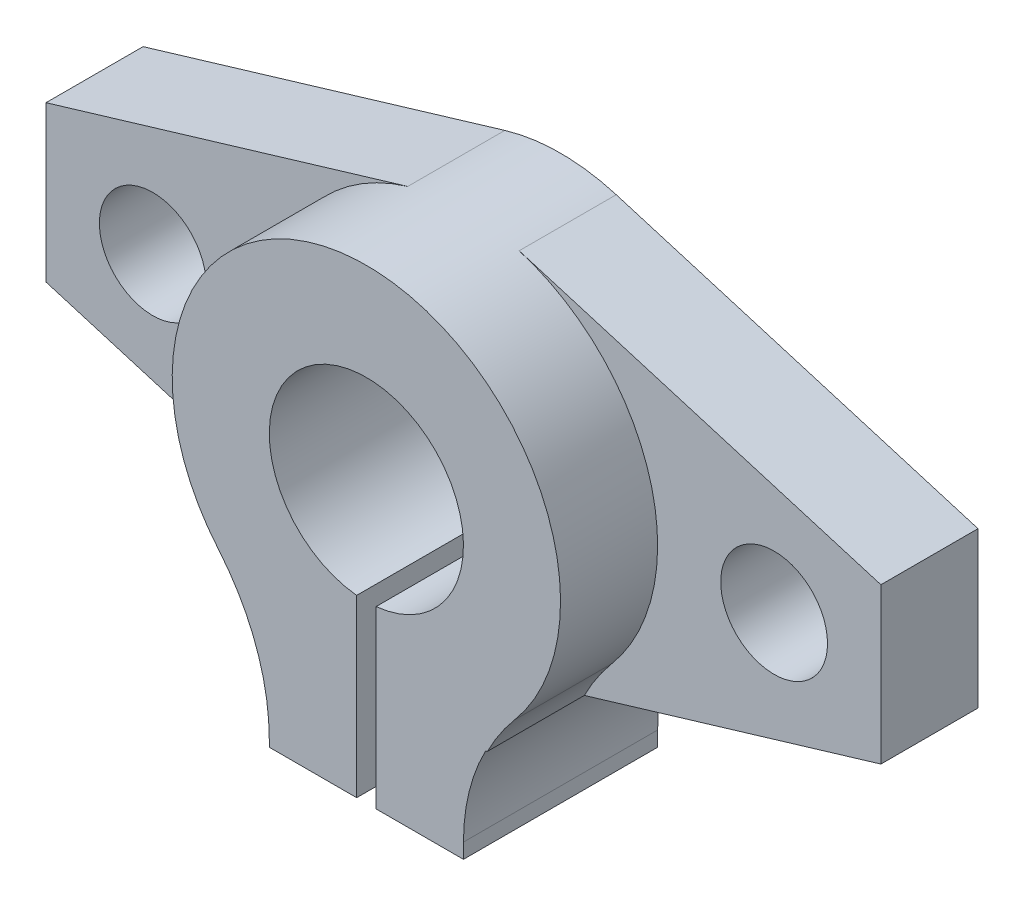
ISO-10303-21;
HEADER;
FILE_DESCRIPTION(('STEP AP214'),'2;1');
FILE_NAME('part.step','',(''),(''),'','','');
FILE_SCHEMA(('AUTOMOTIVE_DESIGN { 1 0 10303 214 1 1 1 1 }'));
ENDSEC;
DATA;
#1=APPLICATION_CONTEXT('core data for automotive mechanical design processes');
#2=APPLICATION_PROTOCOL_DEFINITION('international standard','automotive_design',2000,#1);
#3=PRODUCT_CONTEXT('',#1,'mechanical');
#4=PRODUCT('Part','Part','',(#3));
#5=PRODUCT_RELATED_PRODUCT_CATEGORY('part','',(#4));
#6=PRODUCT_DEFINITION_FORMATION('','',#4);
#7=PRODUCT_DEFINITION_CONTEXT('part definition',#1,'design');
#8=PRODUCT_DEFINITION('design','',#6,#7);
#9=PRODUCT_DEFINITION_SHAPE('','',#8);
#10=(LENGTH_UNIT() NAMED_UNIT(*) SI_UNIT(.MILLI.,.METRE.));
#11=(NAMED_UNIT(*) PLANE_ANGLE_UNIT() SI_UNIT($,.RADIAN.));
#12=(NAMED_UNIT(*) SI_UNIT($,.STERADIAN.) SOLID_ANGLE_UNIT());
#13=UNCERTAINTY_MEASURE_WITH_UNIT(LENGTH_MEASURE(1.E-05),#10,'distance_accuracy_value','');
#14=(GEOMETRIC_REPRESENTATION_CONTEXT(3) GLOBAL_UNCERTAINTY_ASSIGNED_CONTEXT((#13)) GLOBAL_UNIT_ASSIGNED_CONTEXT((#10,
#11,#12)) REPRESENTATION_CONTEXT('',''));
#15=CARTESIAN_POINT('',(0.,0.,0.));
#16=DIRECTION('',(0.,0.,1.));
#17=DIRECTION('',(1.,0.,0.));
#18=AXIS2_PLACEMENT_3D('',#15,#16,#17);
#19=CARTESIAN_POINT('',(0.,0.,0.));
#20=DIRECTION('',(0.,0.,1.));
#21=DIRECTION('',(1.,0.,0.));
#22=AXIS2_PLACEMENT_3D('',#19,#20,#21);
#23=PLANE('',#22);
#24=CARTESIAN_POINT('',(16.,0.,0.));
#25=DIRECTION('',(0.,0.,1.));
#26=DIRECTION('',(1.,0.,0.));
#27=AXIS2_PLACEMENT_3D('',#24,#25,#26);
#28=CIRCLE('',#27,2.75);
#29=CARTESIAN_POINT('',(18.75,0.,0.));
#30=VERTEX_POINT('',#29);
#31=EDGE_CURVE('E216',#30,#30,#28,.F.);
#32=ORIENTED_EDGE('',*,*,#31,.F.);
#33=EDGE_LOOP('',(#32));
#34=FACE_BOUND('',#33,.T.);
#35=CARTESIAN_POINT('',(-16.,0.,0.));
#36=DIRECTION('',(0.,0.,1.));
#37=DIRECTION('',(1.,0.,0.));
#38=AXIS2_PLACEMENT_3D('',#35,#36,#37);
#39=CIRCLE('',#38,2.75);
#40=CARTESIAN_POINT('',(-13.25,0.,0.));
#41=VERTEX_POINT('',#40);
#42=EDGE_CURVE('E282',#41,#41,#39,.T.);
#43=ORIENTED_EDGE('',*,*,#42,.T.);
#44=EDGE_LOOP('',(#43));
#45=FACE_BOUND('',#44,.T.);
#46=CARTESIAN_POINT('',(0.,0.,0.));
#47=DIRECTION('',(0.,0.,1.));
#48=DIRECTION('',(1.,0.,0.));
#49=AXIS2_PLACEMENT_3D('',#46,#47,#48);
#50=CIRCLE('',#49,5.);
#51=CARTESIAN_POINT('',(-0.5,-4.9749371855331,0.));
#52=VERTEX_POINT('',#51);
#53=CARTESIAN_POINT('',(0.500000000000003,-4.9749371855331,0.));
#54=VERTEX_POINT('',#53);
#55=EDGE_CURVE('E341',#52,#54,#50,.F.);
#56=ORIENTED_EDGE('',*,*,#55,.F.);
#57=DIRECTION('',(0.,1.,0.));
#58=VECTOR('',#57,1.);
#59=CARTESIAN_POINT('',(-0.5,-14.,0.));
#60=LINE('',#59,#58);
#61=CARTESIAN_POINT('',(-0.5,-14.,0.));
#62=VERTEX_POINT('',#61);
#63=EDGE_CURVE('E228',#62,#52,#60,.T.);
#64=ORIENTED_EDGE('',*,*,#63,.F.);
#65=DIRECTION('',(-1.,0.,0.));
#66=VECTOR('',#65,1.);
#67=CARTESIAN_POINT('',(-0.5,-14.,0.));
#68=LINE('',#67,#66);
#69=CARTESIAN_POINT('',(-5.,-14.,0.));
#70=VERTEX_POINT('',#69);
#71=EDGE_CURVE('E286',#62,#70,#68,.T.);
#72=ORIENTED_EDGE('',*,*,#71,.T.);
#73=DIRECTION('',(0.,1.,0.));
#74=VECTOR('',#73,1.);
#75=CARTESIAN_POINT('',(-5.,-14.,0.));
#76=LINE('',#75,#74);
#77=CARTESIAN_POINT('',(-5.,-13.659774106197,0.));
#78=VERTEX_POINT('',#77);
#79=EDGE_CURVE('E289',#70,#78,#76,.T.);
#80=ORIENTED_EDGE('',*,*,#79,.T.);
#81=CARTESIAN_POINT('',(-16.1589428632331,-13.659774106197,0.));
#82=DIRECTION('',(0.,0.,-1.));
#83=DIRECTION('',(-1.,0.,0.));
#84=AXIS2_PLACEMENT_3D('',#81,#82,#83);
#85=CIRCLE('',#84,11.1589428632331);
#86=CARTESIAN_POINT('',(-6.22623076309113,-8.57418307264013,0.));
#87=VERTEX_POINT('',#86);
#88=EDGE_CURVE('E292',#87,#78,#85,.T.);
#89=ORIENTED_EDGE('',*,*,#88,.F.);
#90=DIRECTION('',(0.957963371215263,-0.286890535587858,0.));
#91=VECTOR('',#90,1.);
#92=CARTESIAN_POINT('',(-2.86890535587858,-9.57963371215263,0.));
#93=LINE('',#92,#91);
#94=CARTESIAN_POINT('',(-21.5,-4.,0.));
#95=VERTEX_POINT('',#94);
#96=EDGE_CURVE('E393',#95,#87,#93,.T.);
#97=ORIENTED_EDGE('',*,*,#96,.F.);
#98=DIRECTION('',(0.,1.,0.));
#99=VECTOR('',#98,1.);
#100=CARTESIAN_POINT('',(-21.5,0.,0.));
#101=LINE('',#100,#99);
#102=CARTESIAN_POINT('',(-21.5,4.,0.));
#103=VERTEX_POINT('',#102);
#104=EDGE_CURVE('E390',#95,#103,#101,.T.);
#105=ORIENTED_EDGE('',*,*,#104,.T.);
#106=DIRECTION('',(0.957963371215263,0.286890535587858,0.));
#107=VECTOR('',#106,1.);
#108=CARTESIAN_POINT('',(-2.86890535587858,9.57963371215263,0.));
#109=LINE('',#108,#107);
#110=CARTESIAN_POINT('',(-2.86890535587858,9.57963371215263,0.));
#111=VERTEX_POINT('',#110);
#112=EDGE_CURVE('E387',#103,#111,#109,.T.);
#113=ORIENTED_EDGE('',*,*,#112,.T.);
#114=CARTESIAN_POINT('',(0.,0.,0.));
#115=DIRECTION('',(0.,0.,1.));
#116=DIRECTION('',(1.,0.,0.));
#117=AXIS2_PLACEMENT_3D('',#114,#115,#116);
#118=CIRCLE('',#117,10.);
#119=CARTESIAN_POINT('',(2.86890535587858,9.57963371215263,0.));
#120=VERTEX_POINT('',#119);
#121=EDGE_CURVE('E294',#120,#111,#118,.T.);
#122=ORIENTED_EDGE('',*,*,#121,.F.);
#123=DIRECTION('',(-0.957963371215263,0.286890535587858,0.));
#124=VECTOR('',#123,1.);
#125=CARTESIAN_POINT('',(2.86890535587858,9.57963371215263,0.));
#126=LINE('',#125,#124);
#127=CARTESIAN_POINT('',(21.5,4.,0.));
#128=VERTEX_POINT('',#127);
#129=EDGE_CURVE('E272',#128,#120,#126,.T.);
#130=ORIENTED_EDGE('',*,*,#129,.F.);
#131=DIRECTION('',(0.,1.,0.));
#132=VECTOR('',#131,1.);
#133=CARTESIAN_POINT('',(21.5,0.,0.));
#134=LINE('',#133,#132);
#135=CARTESIAN_POINT('',(21.5,-4.,0.));
#136=VERTEX_POINT('',#135);
#137=EDGE_CURVE('E269',#136,#128,#134,.T.);
#138=ORIENTED_EDGE('',*,*,#137,.F.);
#139=DIRECTION('',(-0.957963371215263,-0.286890535587858,0.));
#140=VECTOR('',#139,1.);
#141=CARTESIAN_POINT('',(2.86890535587858,-9.57963371215263,0.));
#142=LINE('',#141,#140);
#143=CARTESIAN_POINT('',(6.13497884361172,-8.60151116559181,0.));
#144=VERTEX_POINT('',#143);
#145=EDGE_CURVE('E266',#136,#144,#142,.T.);
#146=ORIENTED_EDGE('',*,*,#145,.T.);
#147=CARTESIAN_POINT('',(15.,-13.228756555323,0.));
#148=DIRECTION('',(0.,0.,1.));
#149=DIRECTION('',(1.,0.,0.));
#150=AXIS2_PLACEMENT_3D('',#147,#148,#149);
#151=CIRCLE('',#150,10.);
#152=CARTESIAN_POINT('',(5.,-13.2287565553229,0.));
#153=VERTEX_POINT('',#152);
#154=EDGE_CURVE('E237',#144,#153,#151,.T.);
#155=ORIENTED_EDGE('',*,*,#154,.T.);
#156=DIRECTION('',(0.,1.,0.));
#157=VECTOR('',#156,1.);
#158=CARTESIAN_POINT('',(5.,-14.,0.));
#159=LINE('',#158,#157);
#160=CARTESIAN_POINT('',(5.,-14.,0.));
#161=VERTEX_POINT('',#160);
#162=EDGE_CURVE('E232',#161,#153,#159,.T.);
#163=ORIENTED_EDGE('',*,*,#162,.F.);
#164=DIRECTION('',(-1.,0.,0.));
#165=VECTOR('',#164,1.);
#166=CARTESIAN_POINT('',(5.,-14.,0.));
#167=LINE('',#166,#165);
#168=CARTESIAN_POINT('',(0.500000000000006,-14.,0.));
#169=VERTEX_POINT('',#168);
#170=EDGE_CURVE('E209',#161,#169,#167,.T.);
#171=ORIENTED_EDGE('',*,*,#170,.T.);
#172=DIRECTION('',(0.,1.,0.));
#173=VECTOR('',#172,1.);
#174=CARTESIAN_POINT('',(0.500000000000006,-14.,0.));
#175=LINE('',#174,#173);
#176=EDGE_CURVE('E221',#169,#54,#175,.T.);
#177=ORIENTED_EDGE('',*,*,#176,.T.);
#178=EDGE_LOOP('',(#56,#64,#72,#80,#89,#97,#105,#113,#122,#130,#138,#146,#155,#163,#171,#177));
#179=FACE_BOUND('',#178,.T.);
#180=ADVANCED_FACE('F124',(#34,#45,#179),#23,.F.);
#181=CARTESIAN_POINT('',(0.,0.,10.));
#182=DIRECTION('',(0.,0.,1.));
#183=DIRECTION('',(1.,0.,0.));
#184=AXIS2_PLACEMENT_3D('',#181,#182,#183);
#185=PLANE('',#184);
#186=DIRECTION('',(0.,1.,0.));
#187=VECTOR('',#186,1.);
#188=CARTESIAN_POINT('',(-0.5,0.,10.));
#189=LINE('',#188,#187);
#190=CARTESIAN_POINT('',(-0.5,-14.,10.));
#191=VERTEX_POINT('',#190);
#192=CARTESIAN_POINT('',(-0.5,-4.9749371855331,9.99999999999999));
#193=VERTEX_POINT('',#192);
#194=EDGE_CURVE('E320',#191,#193,#189,.T.);
#195=ORIENTED_EDGE('',*,*,#194,.T.);
#196=CARTESIAN_POINT('',(0.,0.,9.99999999999999));
#197=DIRECTION('',(0.,0.,1.));
#198=DIRECTION('',(1.,0.,0.));
#199=AXIS2_PLACEMENT_3D('',#196,#197,#198);
#200=CIRCLE('',#199,5.);
#201=CARTESIAN_POINT('',(0.500000000000003,-4.9749371855331,9.99999999999999));
#202=VERTEX_POINT('',#201);
#203=EDGE_CURVE('E12',#193,#202,#200,.F.);
#204=ORIENTED_EDGE('',*,*,#203,.T.);
#205=DIRECTION('',(0.,-1.,0.));
#206=VECTOR('',#205,1.);
#207=CARTESIAN_POINT('',(0.500000000000002,0.,10.));
#208=LINE('',#207,#206);
#209=CARTESIAN_POINT('',(0.500000000000006,-14.,10.));
#210=VERTEX_POINT('',#209);
#211=EDGE_CURVE('E317',#202,#210,#208,.T.);
#212=ORIENTED_EDGE('',*,*,#211,.T.);
#213=DIRECTION('',(1.,0.,0.));
#214=VECTOR('',#213,1.);
#215=CARTESIAN_POINT('',(0.,-14.,10.));
#216=LINE('',#215,#214);
#217=CARTESIAN_POINT('',(5.,-14.,10.));
#218=VERTEX_POINT('',#217);
#219=EDGE_CURVE('E212',#210,#218,#216,.T.);
#220=ORIENTED_EDGE('',*,*,#219,.T.);
#221=DIRECTION('',(0.,1.,0.));
#222=VECTOR('',#221,1.);
#223=CARTESIAN_POINT('',(5.,0.,10.));
#224=LINE('',#223,#222);
#225=CARTESIAN_POINT('',(5.,-13.228756555323,10.));
#226=VERTEX_POINT('',#225);
#227=EDGE_CURVE('E312',#218,#226,#224,.T.);
#228=ORIENTED_EDGE('',*,*,#227,.T.);
#229=CARTESIAN_POINT('',(15.,-13.228756555323,10.));
#230=DIRECTION('',(0.,0.,1.));
#231=DIRECTION('',(1.,0.,0.));
#232=AXIS2_PLACEMENT_3D('',#229,#230,#231);
#233=CIRCLE('',#232,10.);
#234=CARTESIAN_POINT('',(6.13497884361172,-8.60151116559181,10.));
#235=VERTEX_POINT('',#234);
#236=EDGE_CURVE('E306',#226,#235,#233,.F.);
#237=ORIENTED_EDGE('',*,*,#236,.T.);
#238=DIRECTION('',(0.957963371215263,0.286890535587858,0.));
#239=VECTOR('',#238,1.);
#240=CARTESIAN_POINT('',(2.86890535587858,-9.57963371215263,10.));
#241=LINE('',#240,#239);
#242=CARTESIAN_POINT('',(6.22623076309114,-8.57418307264013,10.));
#243=VERTEX_POINT('',#242);
#244=EDGE_CURVE('E325',#235,#243,#241,.T.);
#245=ORIENTED_EDGE('',*,*,#244,.T.);
#246=CARTESIAN_POINT('',(16.1589428632331,-13.659774106197,10.));
#247=DIRECTION('',(0.,0.,1.));
#248=DIRECTION('',(1.,0.,0.));
#249=AXIS2_PLACEMENT_3D('',#246,#247,#248);
#250=CIRCLE('',#249,11.1589428632331);
#251=CARTESIAN_POINT('',(7.63693298274921,-6.45579233069011,10.));
#252=VERTEX_POINT('',#251);
#253=EDGE_CURVE('E328',#252,#243,#250,.T.);
#254=ORIENTED_EDGE('',*,*,#253,.F.);
#255=CARTESIAN_POINT('',(0.,0.,10.));
#256=DIRECTION('',(0.,0.,1.));
#257=DIRECTION('',(1.,0.,0.));
#258=AXIS2_PLACEMENT_3D('',#255,#256,#257);
#259=CIRCLE('',#258,10.);
#260=CARTESIAN_POINT('',(-7.63693298274922,-6.4557923306901,10.));
#261=VERTEX_POINT('',#260);
#262=EDGE_CURVE('E330',#252,#261,#259,.T.);
#263=ORIENTED_EDGE('',*,*,#262,.T.);
#264=CARTESIAN_POINT('',(-16.1589428632331,-13.659774106197,10.));
#265=DIRECTION('',(0.,0.,1.));
#266=DIRECTION('',(1.,0.,0.));
#267=AXIS2_PLACEMENT_3D('',#264,#265,#266);
#268=CIRCLE('',#267,11.1589428632331);
#269=CARTESIAN_POINT('',(-5.,-13.659774106197,10.));
#270=VERTEX_POINT('',#269);
#271=EDGE_CURVE('E464',#270,#261,#268,.T.);
#272=ORIENTED_EDGE('',*,*,#271,.F.);
#273=DIRECTION('',(0.,-1.,0.));
#274=VECTOR('',#273,1.);
#275=CARTESIAN_POINT('',(-5.,0.,10.));
#276=LINE('',#275,#274);
#277=CARTESIAN_POINT('',(-5.,-14.,10.));
#278=VERTEX_POINT('',#277);
#279=EDGE_CURVE('E460',#270,#278,#276,.T.);
#280=ORIENTED_EDGE('',*,*,#279,.T.);
#281=DIRECTION('',(1.,0.,0.));
#282=VECTOR('',#281,1.);
#283=CARTESIAN_POINT('',(0.,-14.,10.));
#284=LINE('',#283,#282);
#285=EDGE_CURVE('E458',#278,#191,#284,.T.);
#286=ORIENTED_EDGE('',*,*,#285,.T.);
#287=EDGE_LOOP('',(#195,#204,#212,#220,#228,#237,#245,#254,#263,#272,#280,#286));
#288=FACE_BOUND('',#287,.T.);
#289=ADVANCED_FACE('F316',(#288),#185,.T.);
#290=CARTESIAN_POINT('',(0.,0.,5.));
#291=DIRECTION('',(0.,0.,1.));
#292=DIRECTION('',(1.,0.,0.));
#293=AXIS2_PLACEMENT_3D('',#290,#291,#292);
#294=PLANE('',#293);
#295=CARTESIAN_POINT('',(-16.,0.,5.));
#296=DIRECTION('',(0.,0.,1.));
#297=DIRECTION('',(1.,0.,0.));
#298=AXIS2_PLACEMENT_3D('',#295,#296,#297);
#299=CIRCLE('',#298,2.75);
#300=CARTESIAN_POINT('',(-13.25,0.,5.));
#301=VERTEX_POINT('',#300);
#302=EDGE_CURVE('E366',#301,#301,#299,.T.);
#303=ORIENTED_EDGE('',*,*,#302,.F.);
#304=EDGE_LOOP('',(#303));
#305=FACE_BOUND('',#304,.T.);
#306=DIRECTION('',(0.957963371215263,-0.286890535587858,0.));
#307=VECTOR('',#306,1.);
#308=CARTESIAN_POINT('',(-2.86890535587858,-9.57963371215263,5.));
#309=LINE('',#308,#307);
#310=CARTESIAN_POINT('',(-21.5,-4.,5.));
#311=VERTEX_POINT('',#310);
#312=CARTESIAN_POINT('',(-6.22623076309114,-8.57418307264013,5.));
#313=VERTEX_POINT('',#312);
#314=EDGE_CURVE('E373',#311,#313,#309,.T.);
#315=ORIENTED_EDGE('',*,*,#314,.T.);
#316=CARTESIAN_POINT('',(-16.1589428632331,-13.659774106197,5.));
#317=DIRECTION('',(0.,0.,1.));
#318=DIRECTION('',(1.,0.,0.));
#319=AXIS2_PLACEMENT_3D('',#316,#317,#318);
#320=CIRCLE('',#319,11.1589428632331);
#321=CARTESIAN_POINT('',(-7.63693298274922,-6.4557923306901,5.));
#322=VERTEX_POINT('',#321);
#323=EDGE_CURVE('E132',#313,#322,#320,.T.);
#324=ORIENTED_EDGE('',*,*,#323,.T.);
#325=CARTESIAN_POINT('',(0.,0.,5.));
#326=DIRECTION('',(0.,0.,1.));
#327=DIRECTION('',(1.,0.,0.));
#328=AXIS2_PLACEMENT_3D('',#325,#326,#327);
#329=CIRCLE('',#328,10.);
#330=CARTESIAN_POINT('',(-2.86890535587858,9.57963371215263,5.));
#331=VERTEX_POINT('',#330);
#332=EDGE_CURVE('E354',#331,#322,#329,.T.);
#333=ORIENTED_EDGE('',*,*,#332,.F.);
#334=DIRECTION('',(0.957963371215263,0.286890535587858,0.));
#335=VECTOR('',#334,1.);
#336=CARTESIAN_POINT('',(-2.86890535587858,9.57963371215263,5.));
#337=LINE('',#336,#335);
#338=CARTESIAN_POINT('',(-21.5,4.,5.));
#339=VERTEX_POINT('',#338);
#340=EDGE_CURVE('E362',#339,#331,#337,.T.);
#341=ORIENTED_EDGE('',*,*,#340,.F.);
#342=DIRECTION('',(0.,1.,0.));
#343=VECTOR('',#342,1.);
#344=CARTESIAN_POINT('',(-21.5,0.,5.));
#345=LINE('',#344,#343);
#346=EDGE_CURVE('E365',#311,#339,#345,.T.);
#347=ORIENTED_EDGE('',*,*,#346,.F.);
#348=EDGE_LOOP('',(#315,#324,#333,#341,#347));
#349=FACE_BOUND('',#348,.T.);
#350=ADVANCED_FACE('F408',(#305,#349),#294,.T.);
#351=CARTESIAN_POINT('',(-2.86890535587858,9.57963371215263,5.));
#352=DIRECTION('',(-0.286890535587858,0.957963371215263,0.));
#353=DIRECTION('',(-0.957963371215263,-0.286890535587858,0.));
#354=AXIS2_PLACEMENT_3D('',#351,#352,#353);
#355=PLANE('',#354);
#356=ORIENTED_EDGE('',*,*,#112,.F.);
#357=DIRECTION('',(0.,0.,-1.));
#358=VECTOR('',#357,1.);
#359=CARTESIAN_POINT('',(-21.5,4.,5.));
#360=LINE('',#359,#358);
#361=EDGE_CURVE('E359',#339,#103,#360,.T.);
#362=ORIENTED_EDGE('',*,*,#361,.F.);
#363=ORIENTED_EDGE('',*,*,#340,.T.);
#364=DIRECTION('',(0.,0.,-1.));
#365=VECTOR('',#364,1.);
#366=CARTESIAN_POINT('',(-2.86890535587858,9.57963371215263,5.));
#367=LINE('',#366,#365);
#368=EDGE_CURVE('E357',#331,#111,#367,.T.);
#369=ORIENTED_EDGE('',*,*,#368,.T.);
#370=EDGE_LOOP('',(#356,#362,#363,#369));
#371=FACE_BOUND('',#370,.T.);
#372=ADVANCED_FACE('F400',(#371),#355,.T.);
#373=CARTESIAN_POINT('',(-21.5,0.,5.));
#374=DIRECTION('',(-1.,0.,0.));
#375=DIRECTION('',(0.,0.,1.));
#376=AXIS2_PLACEMENT_3D('',#373,#374,#375);
#377=PLANE('',#376);
#378=ORIENTED_EDGE('',*,*,#104,.F.);
#379=DIRECTION('',(0.,0.,-1.));
#380=VECTOR('',#379,1.);
#381=CARTESIAN_POINT('',(-21.5,-4.,5.));
#382=LINE('',#381,#380);
#383=EDGE_CURVE('E148',#311,#95,#382,.T.);
#384=ORIENTED_EDGE('',*,*,#383,.F.);
#385=ORIENTED_EDGE('',*,*,#346,.T.);
#386=ORIENTED_EDGE('',*,*,#361,.T.);
#387=EDGE_LOOP('',(#378,#384,#385,#386));
#388=FACE_BOUND('',#387,.T.);
#389=ADVANCED_FACE('F397',(#388),#377,.T.);
#390=CARTESIAN_POINT('',(-2.86890535587858,-9.57963371215263,5.));
#391=DIRECTION('',(0.286890535587858,0.957963371215263,0.));
#392=DIRECTION('',(-0.957963371215263,0.286890535587858,0.));
#393=AXIS2_PLACEMENT_3D('',#390,#391,#392);
#394=PLANE('',#393);
#395=ORIENTED_EDGE('',*,*,#96,.T.);
#396=DIRECTION('',(0.,0.,-1.));
#397=VECTOR('',#396,1.);
#398=CARTESIAN_POINT('',(-6.22623076309113,-8.57418307264013,5.));
#399=LINE('',#398,#397);
#400=EDGE_CURVE('E371',#313,#87,#399,.T.);
#401=ORIENTED_EDGE('',*,*,#400,.F.);
#402=ORIENTED_EDGE('',*,*,#314,.F.);
#403=ORIENTED_EDGE('',*,*,#383,.T.);
#404=EDGE_LOOP('',(#395,#401,#402,#403));
#405=FACE_BOUND('',#404,.T.);
#406=ADVANCED_FACE('F407',(#405),#394,.F.);
#407=CARTESIAN_POINT('',(-16.,0.,5.));
#408=DIRECTION('',(0.,0.,-1.));
#409=DIRECTION('',(-1.,0.,0.));
#410=AXIS2_PLACEMENT_3D('',#407,#408,#409);
#411=CYLINDRICAL_SURFACE('',#410,2.75);
#412=ORIENTED_EDGE('',*,*,#302,.T.);
#413=EDGE_LOOP('',(#412));
#414=FACE_BOUND('',#413,.T.);
#415=ORIENTED_EDGE('',*,*,#42,.F.);
#416=EDGE_LOOP('',(#415));
#417=FACE_BOUND('',#416,.T.);
#418=ADVANCED_FACE('F522',(#414,#417),#411,.F.);
#419=CARTESIAN_POINT('',(7.63693298274921,-6.45579233069011,5.));
#420=VERTEX_POINT('',#419);
#421=CARTESIAN_POINT('',(2.86890535587858,9.57963371215263,5.));
#422=VERTEX_POINT('',#421);
#423=EDGE_CURVE('E340',#420,#422,#329,.T.);
#424=ORIENTED_EDGE('',*,*,#423,.F.);
#425=CARTESIAN_POINT('',(16.1589428632331,-13.659774106197,5.));
#426=DIRECTION('',(0.,0.,1.));
#427=DIRECTION('',(1.,0.,0.));
#428=AXIS2_PLACEMENT_3D('',#425,#426,#427);
#429=CIRCLE('',#428,11.1589428632331);
#430=CARTESIAN_POINT('',(6.22623076309114,-8.57418307264013,5.));
#431=VERTEX_POINT('',#430);
#432=EDGE_CURVE('E338',#420,#431,#429,.T.);
#433=ORIENTED_EDGE('',*,*,#432,.T.);
#434=DIRECTION('',(-0.957963371215263,-0.286890535587858,0.));
#435=VECTOR('',#434,1.);
#436=CARTESIAN_POINT('',(2.86890535587858,-9.57963371215263,5.));
#437=LINE('',#436,#435);
#438=CARTESIAN_POINT('',(21.5,-4.,5.));
#439=VERTEX_POINT('',#438);
#440=EDGE_CURVE('E249',#439,#431,#437,.T.);
#441=ORIENTED_EDGE('',*,*,#440,.F.);
#442=DIRECTION('',(0.,1.,0.));
#443=VECTOR('',#442,1.);
#444=CARTESIAN_POINT('',(21.5,0.,5.));
#445=LINE('',#444,#443);
#446=CARTESIAN_POINT('',(21.5,4.,5.));
#447=VERTEX_POINT('',#446);
#448=EDGE_CURVE('E253',#439,#447,#445,.T.);
#449=ORIENTED_EDGE('',*,*,#448,.T.);
#450=DIRECTION('',(-0.957963371215263,0.286890535587858,0.));
#451=VECTOR('',#450,1.);
#452=CARTESIAN_POINT('',(2.86890535587858,9.57963371215263,5.));
#453=LINE('',#452,#451);
#454=EDGE_CURVE('E263',#447,#422,#453,.T.);
#455=ORIENTED_EDGE('',*,*,#454,.T.);
#456=EDGE_LOOP('',(#424,#433,#441,#449,#455));
#457=FACE_BOUND('',#456,.T.);
#458=CARTESIAN_POINT('',(16.,0.,5.));
#459=DIRECTION('',(0.,0.,1.));
#460=DIRECTION('',(1.,0.,0.));
#461=AXIS2_PLACEMENT_3D('',#458,#459,#460);
#462=CIRCLE('',#461,2.75);
#463=CARTESIAN_POINT('',(18.75,0.,5.));
#464=VERTEX_POINT('',#463);
#465=EDGE_CURVE('E254',#464,#464,#462,.F.);
#466=ORIENTED_EDGE('',*,*,#465,.T.);
#467=EDGE_LOOP('',(#466));
#468=FACE_BOUND('',#467,.T.);
#469=ADVANCED_FACE('F489',(#457,#468),#294,.T.);
#470=CARTESIAN_POINT('',(2.86890535587858,-9.57963371215263,5.));
#471=DIRECTION('',(0.286890535587858,-0.957963371215263,0.));
#472=DIRECTION('',(0.957963371215263,0.286890535587858,0.));
#473=AXIS2_PLACEMENT_3D('',#470,#471,#472);
#474=PLANE('',#473);
#475=ORIENTED_EDGE('',*,*,#145,.F.);
#476=DIRECTION('',(0.,0.,-1.));
#477=VECTOR('',#476,1.);
#478=CARTESIAN_POINT('',(21.5,-4.,5.));
#479=LINE('',#478,#477);
#480=EDGE_CURVE('E278',#439,#136,#479,.T.);
#481=ORIENTED_EDGE('',*,*,#480,.F.);
#482=ORIENTED_EDGE('',*,*,#440,.T.);
#483=DIRECTION('',(0.,0.,-1.));
#484=VECTOR('',#483,1.);
#485=CARTESIAN_POINT('',(6.22623076309114,-8.57418307264013,10.));
#486=LINE('',#485,#484);
#487=EDGE_CURVE('E139',#243,#431,#486,.T.);
#488=ORIENTED_EDGE('',*,*,#487,.F.);
#489=ORIENTED_EDGE('',*,*,#244,.F.);
#490=DIRECTION('',(0.,0.,-1.));
#491=VECTOR('',#490,1.);
#492=CARTESIAN_POINT('',(6.13497884361172,-8.60151116559181,5.));
#493=LINE('',#492,#491);
#494=EDGE_CURVE('E281',#235,#144,#493,.T.);
#495=ORIENTED_EDGE('',*,*,#494,.T.);
#496=EDGE_LOOP('',(#475,#481,#482,#488,#489,#495));
#497=FACE_BOUND('',#496,.T.);
#498=ADVANCED_FACE('F497',(#497),#474,.T.);
#499=CARTESIAN_POINT('',(21.5,0.,5.));
#500=DIRECTION('',(-1.,0.,0.));
#501=DIRECTION('',(0.,0.,1.));
#502=AXIS2_PLACEMENT_3D('',#499,#500,#501);
#503=PLANE('',#502);
#504=ORIENTED_EDGE('',*,*,#137,.T.);
#505=DIRECTION('',(0.,0.,-1.));
#506=VECTOR('',#505,1.);
#507=CARTESIAN_POINT('',(21.5,4.,5.));
#508=LINE('',#507,#506);
#509=EDGE_CURVE('E275',#447,#128,#508,.T.);
#510=ORIENTED_EDGE('',*,*,#509,.F.);
#511=ORIENTED_EDGE('',*,*,#448,.F.);
#512=ORIENTED_EDGE('',*,*,#480,.T.);
#513=EDGE_LOOP('',(#504,#510,#511,#512));
#514=FACE_BOUND('',#513,.T.);
#515=ADVANCED_FACE('F495',(#514),#503,.F.);
#516=CARTESIAN_POINT('',(16.,0.,5.));
#517=DIRECTION('',(0.,0.,-1.));
#518=DIRECTION('',(-1.,0.,0.));
#519=AXIS2_PLACEMENT_3D('',#516,#517,#518);
#520=CYLINDRICAL_SURFACE('',#519,2.75);
#521=ORIENTED_EDGE('',*,*,#465,.F.);
#522=EDGE_LOOP('',(#521));
#523=FACE_BOUND('',#522,.T.);
#524=ORIENTED_EDGE('',*,*,#31,.T.);
#525=EDGE_LOOP('',(#524));
#526=FACE_BOUND('',#525,.T.);
#527=ADVANCED_FACE('F532',(#523,#526),#520,.F.);
#528=CARTESIAN_POINT('',(2.86890535587858,9.57963371215263,5.));
#529=DIRECTION('',(-0.286890535587858,-0.957963371215263,0.));
#530=DIRECTION('',(0.957963371215263,-0.286890535587858,0.));
#531=AXIS2_PLACEMENT_3D('',#528,#529,#530);
#532=PLANE('',#531);
#533=ORIENTED_EDGE('',*,*,#129,.T.);
#534=DIRECTION('',(0.,0.,-1.));
#535=VECTOR('',#534,1.);
#536=CARTESIAN_POINT('',(2.86890535587858,9.57963371215263,5.));
#537=LINE('',#536,#535);
#538=EDGE_CURVE('E279',#422,#120,#537,.T.);
#539=ORIENTED_EDGE('',*,*,#538,.F.);
#540=ORIENTED_EDGE('',*,*,#454,.F.);
#541=ORIENTED_EDGE('',*,*,#509,.T.);
#542=EDGE_LOOP('',(#533,#539,#540,#541));
#543=FACE_BOUND('',#542,.T.);
#544=ADVANCED_FACE('F488',(#543),#532,.F.);
#545=CARTESIAN_POINT('',(5.,-14.,5.));
#546=DIRECTION('',(0.,-1.,0.));
#547=DIRECTION('',(0.,0.,-1.));
#548=AXIS2_PLACEMENT_3D('',#545,#546,#547);
#549=PLANE('',#548);
#550=ORIENTED_EDGE('',*,*,#170,.F.);
#551=DIRECTION('',(0.,0.,-1.));
#552=VECTOR('',#551,1.);
#553=CARTESIAN_POINT('',(5.,-14.,5.));
#554=LINE('',#553,#552);
#555=EDGE_CURVE('E217',#218,#161,#554,.T.);
#556=ORIENTED_EDGE('',*,*,#555,.F.);
#557=ORIENTED_EDGE('',*,*,#219,.F.);
#558=DIRECTION('',(0.,0.,-1.));
#559=VECTOR('',#558,1.);
#560=CARTESIAN_POINT('',(0.500000000000006,-14.,5.));
#561=LINE('',#560,#559);
#562=EDGE_CURVE('E204',#210,#169,#561,.T.);
#563=ORIENTED_EDGE('',*,*,#562,.T.);
#564=EDGE_LOOP('',(#550,#556,#557,#563));
#565=FACE_BOUND('',#564,.T.);
#566=ADVANCED_FACE('F206',(#565),#549,.T.);
#567=CARTESIAN_POINT('',(5.,-14.,5.));
#568=DIRECTION('',(-1.,0.,0.));
#569=DIRECTION('',(0.,0.,1.));
#570=AXIS2_PLACEMENT_3D('',#567,#568,#569);
#571=PLANE('',#570);
#572=ORIENTED_EDGE('',*,*,#162,.T.);
#573=DIRECTION('',(0.,0.,-1.));
#574=VECTOR('',#573,1.);
#575=CARTESIAN_POINT('',(5.,-13.2287565553229,5.));
#576=LINE('',#575,#574);
#577=EDGE_CURVE('E242',#226,#153,#576,.T.);
#578=ORIENTED_EDGE('',*,*,#577,.F.);
#579=ORIENTED_EDGE('',*,*,#227,.F.);
#580=ORIENTED_EDGE('',*,*,#555,.T.);
#581=EDGE_LOOP('',(#572,#578,#579,#580));
#582=FACE_BOUND('',#581,.T.);
#583=ADVANCED_FACE('F310',(#582),#571,.F.);
#584=CARTESIAN_POINT('',(15.,-13.228756555323,5.));
#585=DIRECTION('',(0.,0.,-1.));
#586=DIRECTION('',(-1.,0.,0.));
#587=AXIS2_PLACEMENT_3D('',#584,#585,#586);
#588=CYLINDRICAL_SURFACE('',#587,10.);
#589=ORIENTED_EDGE('',*,*,#154,.F.);
#590=ORIENTED_EDGE('',*,*,#494,.F.);
#591=ORIENTED_EDGE('',*,*,#236,.F.);
#592=ORIENTED_EDGE('',*,*,#577,.T.);
#593=EDGE_LOOP('',(#589,#590,#591,#592));
#594=FACE_BOUND('',#593,.T.);
#595=ADVANCED_FACE('F303',(#594),#588,.F.);
#596=CARTESIAN_POINT('',(0.,0.,5.));
#597=DIRECTION('',(0.,0.,-1.));
#598=DIRECTION('',(-1.,0.,0.));
#599=AXIS2_PLACEMENT_3D('',#596,#597,#598);
#600=CYLINDRICAL_SURFACE('',#599,10.);
#601=ORIENTED_EDGE('',*,*,#121,.T.);
#602=ORIENTED_EDGE('',*,*,#368,.F.);
#603=ORIENTED_EDGE('',*,*,#332,.T.);
#604=DIRECTION('',(0.,0.,-1.));
#605=VECTOR('',#604,1.);
#606=CARTESIAN_POINT('',(-7.63693298274922,-6.4557923306901,10.));
#607=LINE('',#606,#605);
#608=EDGE_CURVE('E333',#261,#322,#607,.T.);
#609=ORIENTED_EDGE('',*,*,#608,.F.);
#610=ORIENTED_EDGE('',*,*,#262,.F.);
#611=DIRECTION('',(0.,0.,-1.));
#612=VECTOR('',#611,1.);
#613=CARTESIAN_POINT('',(7.63693298274921,-6.45579233069011,10.));
#614=LINE('',#613,#612);
#615=EDGE_CURVE('E344',#252,#420,#614,.T.);
#616=ORIENTED_EDGE('',*,*,#615,.T.);
#617=ORIENTED_EDGE('',*,*,#423,.T.);
#618=ORIENTED_EDGE('',*,*,#538,.T.);
#619=EDGE_LOOP('',(#601,#602,#603,#609,#610,#616,#617,#618));
#620=FACE_BOUND('',#619,.T.);
#621=ADVANCED_FACE('F485',(#620),#600,.T.);
#622=CARTESIAN_POINT('',(-16.1589428632331,-13.659774106197,5.));
#623=DIRECTION('',(0.,0.,-1.));
#624=DIRECTION('',(-1.,0.,0.));
#625=AXIS2_PLACEMENT_3D('',#622,#623,#624);
#626=CYLINDRICAL_SURFACE('',#625,11.1589428632331);
#627=DIRECTION('',(0.,0.,-1.));
#628=VECTOR('',#627,1.);
#629=CARTESIAN_POINT('',(-5.,-13.659774106197,5.));
#630=LINE('',#629,#628);
#631=EDGE_CURVE('E245',#270,#78,#630,.T.);
#632=ORIENTED_EDGE('',*,*,#631,.F.);
#633=ORIENTED_EDGE('',*,*,#271,.T.);
#634=ORIENTED_EDGE('',*,*,#608,.T.);
#635=ORIENTED_EDGE('',*,*,#323,.F.);
#636=ORIENTED_EDGE('',*,*,#400,.T.);
#637=ORIENTED_EDGE('',*,*,#88,.T.);
#638=EDGE_LOOP('',(#632,#633,#634,#635,#636,#637));
#639=FACE_BOUND('',#638,.T.);
#640=ADVANCED_FACE('F478',(#639),#626,.F.);
#641=CARTESIAN_POINT('',(-5.,-14.,5.));
#642=DIRECTION('',(-1.,0.,0.));
#643=DIRECTION('',(0.,0.,1.));
#644=AXIS2_PLACEMENT_3D('',#641,#642,#643);
#645=PLANE('',#644);
#646=ORIENTED_EDGE('',*,*,#79,.F.);
#647=DIRECTION('',(0.,0.,-1.));
#648=VECTOR('',#647,1.);
#649=CARTESIAN_POINT('',(-5.,-14.,5.));
#650=LINE('',#649,#648);
#651=EDGE_CURVE('E235',#278,#70,#650,.T.);
#652=ORIENTED_EDGE('',*,*,#651,.F.);
#653=ORIENTED_EDGE('',*,*,#279,.F.);
#654=ORIENTED_EDGE('',*,*,#631,.T.);
#655=EDGE_LOOP('',(#646,#652,#653,#654));
#656=FACE_BOUND('',#655,.T.);
#657=ADVANCED_FACE('F475',(#656),#645,.T.);
#658=CARTESIAN_POINT('',(-0.5,-14.,5.));
#659=DIRECTION('',(0.,-1.,0.));
#660=DIRECTION('',(0.,0.,-1.));
#661=AXIS2_PLACEMENT_3D('',#658,#659,#660);
#662=PLANE('',#661);
#663=ORIENTED_EDGE('',*,*,#71,.F.);
#664=DIRECTION('',(0.,0.,-1.));
#665=VECTOR('',#664,1.);
#666=CARTESIAN_POINT('',(-0.5,-14.,5.));
#667=LINE('',#666,#665);
#668=EDGE_CURVE('E233',#191,#62,#667,.T.);
#669=ORIENTED_EDGE('',*,*,#668,.F.);
#670=ORIENTED_EDGE('',*,*,#285,.F.);
#671=ORIENTED_EDGE('',*,*,#651,.T.);
#672=EDGE_LOOP('',(#663,#669,#670,#671));
#673=FACE_BOUND('',#672,.T.);
#674=ADVANCED_FACE('F471',(#673),#662,.T.);
#675=CARTESIAN_POINT('',(-0.5,-14.,5.));
#676=DIRECTION('',(-1.,0.,0.));
#677=DIRECTION('',(0.,0.,1.));
#678=AXIS2_PLACEMENT_3D('',#675,#676,#677);
#679=PLANE('',#678);
#680=ORIENTED_EDGE('',*,*,#63,.T.);
#681=DIRECTION('',(0.,0.,-1.));
#682=VECTOR('',#681,1.);
#683=CARTESIAN_POINT('',(-0.5,-4.9749371855331,79.061788553247));
#684=LINE('',#683,#682);
#685=EDGE_CURVE('E452',#193,#52,#684,.T.);
#686=ORIENTED_EDGE('',*,*,#685,.F.);
#687=ORIENTED_EDGE('',*,*,#194,.F.);
#688=ORIENTED_EDGE('',*,*,#668,.T.);
#689=EDGE_LOOP('',(#680,#686,#687,#688));
#690=FACE_BOUND('',#689,.T.);
#691=ADVANCED_FACE('F508',(#690),#679,.F.);
#692=CARTESIAN_POINT('',(0.500000000000006,-14.,5.));
#693=DIRECTION('',(-1.,0.,0.));
#694=DIRECTION('',(0.,-1.,0.));
#695=AXIS2_PLACEMENT_3D('',#692,#693,#694);
#696=PLANE('',#695);
#697=ORIENTED_EDGE('',*,*,#176,.F.);
#698=ORIENTED_EDGE('',*,*,#562,.F.);
#699=ORIENTED_EDGE('',*,*,#211,.F.);
#700=DIRECTION('',(0.,0.,-1.));
#701=VECTOR('',#700,1.);
#702=CARTESIAN_POINT('',(0.500000000000003,-4.9749371855331,79.061788553247));
#703=LINE('',#702,#701);
#704=EDGE_CURVE('E224',#202,#54,#703,.T.);
#705=ORIENTED_EDGE('',*,*,#704,.T.);
#706=EDGE_LOOP('',(#697,#698,#699,#705));
#707=FACE_BOUND('',#706,.T.);
#708=ADVANCED_FACE('F126',(#707),#696,.T.);
#709=CARTESIAN_POINT('',(16.1589428632331,-13.659774106197,10.));
#710=DIRECTION('',(0.,0.,-1.));
#711=DIRECTION('',(-1.,0.,0.));
#712=AXIS2_PLACEMENT_3D('',#709,#710,#711);
#713=CYLINDRICAL_SURFACE('',#712,11.1589428632331);
#714=ORIENTED_EDGE('',*,*,#432,.F.);
#715=ORIENTED_EDGE('',*,*,#615,.F.);
#716=ORIENTED_EDGE('',*,*,#253,.T.);
#717=ORIENTED_EDGE('',*,*,#487,.T.);
#718=EDGE_LOOP('',(#714,#715,#716,#717));
#719=FACE_BOUND('',#718,.T.);
#720=ADVANCED_FACE('F500',(#719),#713,.F.);
#721=CARTESIAN_POINT('',(0.,0.,79.061788553247));
#722=DIRECTION('',(0.,0.,-1.));
#723=DIRECTION('',(-1.,0.,0.));
#724=AXIS2_PLACEMENT_3D('',#721,#722,#723);
#725=CYLINDRICAL_SURFACE('',#724,5.);
#726=ORIENTED_EDGE('',*,*,#685,.T.);
#727=ORIENTED_EDGE('',*,*,#55,.T.);
#728=ORIENTED_EDGE('',*,*,#704,.F.);
#729=ORIENTED_EDGE('',*,*,#203,.F.);
#730=EDGE_LOOP('',(#726,#727,#728,#729));
#731=FACE_BOUND('',#730,.T.);
#732=ADVANCED_FACE('F450',(#731),#725,.F.);
#733=CLOSED_SHELL('',(#180,#289,#350,#372,#389,#406,#418,#469,#498,#515,#527,#544,#566,#583,
#595,#621,#640,#657,#674,#691,#708,#720,#732));
#734=MANIFOLD_SOLID_BREP('B2',#733);
#735=ADVANCED_BREP_SHAPE_REPRESENTATION('',(#18,#734),#14);
#736=SHAPE_DEFINITION_REPRESENTATION(#9,#735);
ENDSEC;
END-ISO-10303-21;
